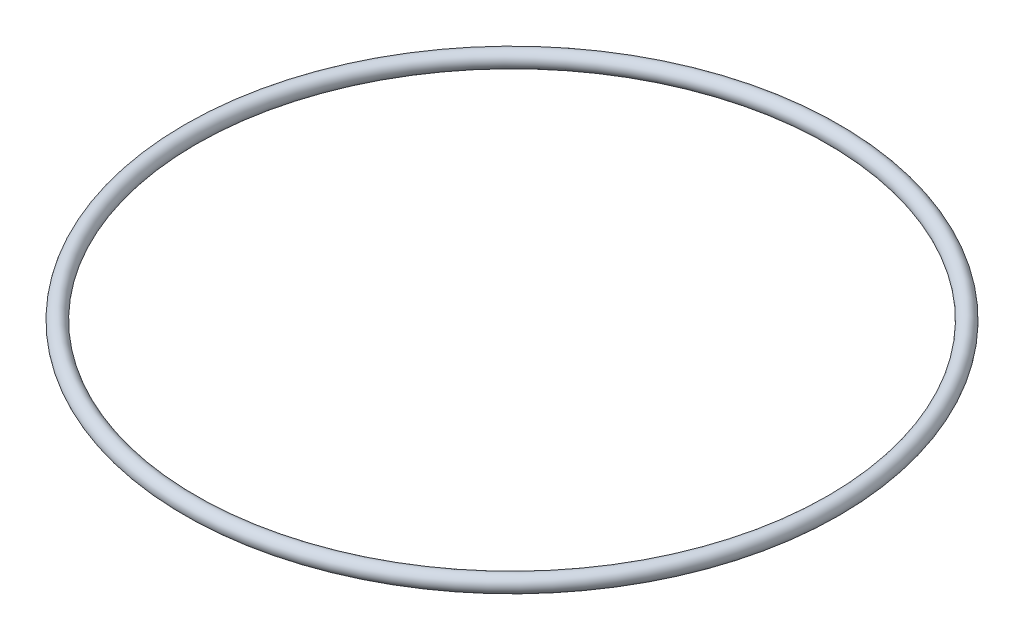
ISO-10303-21;
HEADER;
FILE_DESCRIPTION(('STEP AP214'),'2;1');
FILE_NAME('part.step','',(''),(''),'','','');
FILE_SCHEMA(('AUTOMOTIVE_DESIGN { 1 0 10303 214 1 1 1 1 }'));
ENDSEC;
DATA;
#1=APPLICATION_CONTEXT('core data for automotive mechanical design processes');
#2=APPLICATION_PROTOCOL_DEFINITION('international standard','automotive_design',2000,#1);
#3=PRODUCT_CONTEXT('',#1,'mechanical');
#4=PRODUCT('Part','Part','',(#3));
#5=PRODUCT_RELATED_PRODUCT_CATEGORY('part','',(#4));
#6=PRODUCT_DEFINITION_FORMATION('','',#4);
#7=PRODUCT_DEFINITION_CONTEXT('part definition',#1,'design');
#8=PRODUCT_DEFINITION('design','',#6,#7);
#9=PRODUCT_DEFINITION_SHAPE('','',#8);
#10=(LENGTH_UNIT() NAMED_UNIT(*) SI_UNIT(.MILLI.,.METRE.));
#11=(NAMED_UNIT(*) PLANE_ANGLE_UNIT() SI_UNIT($,.RADIAN.));
#12=(NAMED_UNIT(*) SI_UNIT($,.STERADIAN.) SOLID_ANGLE_UNIT());
#13=UNCERTAINTY_MEASURE_WITH_UNIT(LENGTH_MEASURE(1.E-05),#10,'distance_accuracy_value','');
#14=(GEOMETRIC_REPRESENTATION_CONTEXT(3) GLOBAL_UNCERTAINTY_ASSIGNED_CONTEXT((#13)) GLOBAL_UNIT_ASSIGNED_CONTEXT((#10,
#11,#12)) REPRESENTATION_CONTEXT('',''));
#15=CARTESIAN_POINT('',(0.,0.,0.));
#16=DIRECTION('',(0.,0.,1.));
#17=DIRECTION('',(1.,0.,0.));
#18=AXIS2_PLACEMENT_3D('',#15,#16,#17);
#19=CARTESIAN_POINT('',(0.,0.,0.));
#20=DIRECTION('',(0.,1.,0.));
#21=DIRECTION('',(0.,0.,1.));
#22=AXIS2_PLACEMENT_3D('',#19,#20,#21);
#23=TOROIDAL_SURFACE('',#22,35.6743,0.889000000000003);
#24=CARTESIAN_POINT('',(-35.6743,0.,0.));
#25=DIRECTION('',(0.,0.,1.));
#26=DIRECTION('',(1.,0.,0.));
#27=AXIS2_PLACEMENT_3D('',#24,#25,#26);
#28=CIRCLE('',#27,0.889000000000003);
#29=CARTESIAN_POINT('',(-36.5633,0.,0.));
#30=VERTEX_POINT('',#29);
#31=EDGE_CURVE('E10',#30,#30,#28,.T.);
#32=CARTESIAN_POINT('',(0.,0.,0.));
#33=DIRECTION('',(0.,1.,0.));
#34=DIRECTION('',(0.,0.,1.));
#35=AXIS2_PLACEMENT_3D('',#32,#33,#34);
#36=CIRCLE('',#35,36.5633);
#37=EDGE_CURVE('',#30,#30,#36,.T.);
#38=ORIENTED_EDGE('',*,*,#31,.T.);
#39=ORIENTED_EDGE('',*,*,#31,.F.);
#40=ORIENTED_EDGE('',*,*,#37,.T.);
#41=ORIENTED_EDGE('',*,*,#37,.F.);
#42=EDGE_LOOP('',(#38,#40,#39,#41));
#43=FACE_BOUND('',#42,.T.);
#44=ADVANCED_FACE('F42',(#43),#23,.T.);
#45=CLOSED_SHELL('',(#44));
#46=MANIFOLD_SOLID_BREP('B2',#45);
#47=ADVANCED_BREP_SHAPE_REPRESENTATION('',(#18,#46),#14);
#48=SHAPE_DEFINITION_REPRESENTATION(#9,#47);
ENDSEC;
END-ISO-10303-21;
